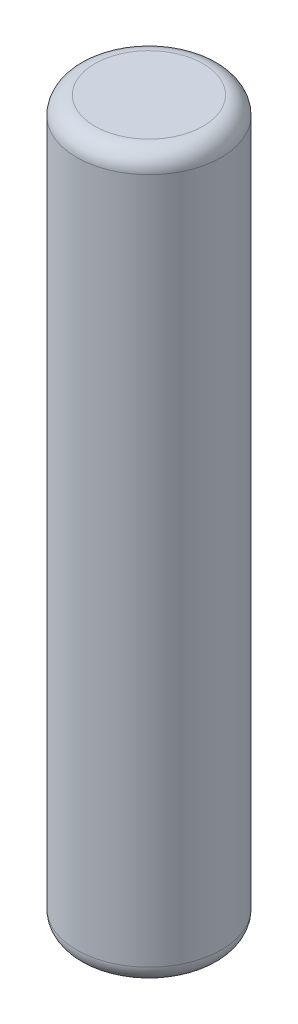
ISO-10303-21;
HEADER;
FILE_DESCRIPTION(('STEP AP214'),'2;1');
FILE_NAME('part.step','',(''),(''),'','','');
FILE_SCHEMA(('AUTOMOTIVE_DESIGN { 1 0 10303 214 1 1 1 1 }'));
ENDSEC;
DATA;
#1=APPLICATION_CONTEXT('core data for automotive mechanical design processes');
#2=APPLICATION_PROTOCOL_DEFINITION('international standard','automotive_design',2000,#1);
#3=PRODUCT_CONTEXT('',#1,'mechanical');
#4=PRODUCT('Part','Part','',(#3));
#5=PRODUCT_RELATED_PRODUCT_CATEGORY('part','',(#4));
#6=PRODUCT_DEFINITION_FORMATION('','',#4);
#7=PRODUCT_DEFINITION_CONTEXT('part definition',#1,'design');
#8=PRODUCT_DEFINITION('design','',#6,#7);
#9=PRODUCT_DEFINITION_SHAPE('','',#8);
#10=(LENGTH_UNIT() NAMED_UNIT(*) SI_UNIT(.MILLI.,.METRE.));
#11=(NAMED_UNIT(*) PLANE_ANGLE_UNIT() SI_UNIT($,.RADIAN.));
#12=(NAMED_UNIT(*) SI_UNIT($,.STERADIAN.) SOLID_ANGLE_UNIT());
#13=UNCERTAINTY_MEASURE_WITH_UNIT(LENGTH_MEASURE(1.E-05),#10,'distance_accuracy_value','');
#14=(GEOMETRIC_REPRESENTATION_CONTEXT(3) GLOBAL_UNCERTAINTY_ASSIGNED_CONTEXT((#13)) GLOBAL_UNIT_ASSIGNED_CONTEXT((#10,
#11,#12)) REPRESENTATION_CONTEXT('',''));
#15=CARTESIAN_POINT('',(0.,0.,0.));
#16=DIRECTION('',(0.,0.,1.));
#17=DIRECTION('',(1.,0.,0.));
#18=AXIS2_PLACEMENT_3D('',#15,#16,#17);
#19=CARTESIAN_POINT('',(0.,34.,0.));
#20=DIRECTION('',(0.,-1.,0.));
#21=DIRECTION('',(0.,0.,-1.));
#22=AXIS2_PLACEMENT_3D('',#19,#20,#21);
#23=CYLINDRICAL_SURFACE('',#22,2.8);
#24=CARTESIAN_POINT('',(0.,6.7,0.));
#25=DIRECTION('',(0.,1.,0.));
#26=DIRECTION('',(0.,0.,1.));
#27=AXIS2_PLACEMENT_3D('',#24,#25,#26);
#28=CIRCLE('',#27,2.8);
#29=CARTESIAN_POINT('',(0.,6.7,2.8));
#30=VERTEX_POINT('',#29);
#31=EDGE_CURVE('E44',#30,#30,#28,.T.);
#32=ORIENTED_EDGE('',*,*,#31,.T.);
#33=EDGE_LOOP('',(#32));
#34=FACE_BOUND('',#33,.T.);
#35=CARTESIAN_POINT('',(0.,33.3,0.));
#36=DIRECTION('',(0.,1.,0.));
#37=DIRECTION('',(0.,0.,1.));
#38=AXIS2_PLACEMENT_3D('',#35,#36,#37);
#39=CIRCLE('',#38,2.8);
#40=CARTESIAN_POINT('',(0.,33.3,2.8));
#41=VERTEX_POINT('',#40);
#42=EDGE_CURVE('E48',#41,#41,#39,.F.);
#43=ORIENTED_EDGE('',*,*,#42,.T.);
#44=EDGE_LOOP('',(#43));
#45=FACE_BOUND('',#44,.T.);
#46=ADVANCED_FACE('F33',(#34,#45),#23,.T.);
#47=CARTESIAN_POINT('',(0.,34.,0.));
#48=DIRECTION('',(0.,1.,0.));
#49=DIRECTION('',(0.,0.,1.));
#50=AXIS2_PLACEMENT_3D('',#47,#48,#49);
#51=PLANE('',#50);
#52=CARTESIAN_POINT('',(0.,34.,0.));
#53=DIRECTION('',(0.,1.,0.));
#54=DIRECTION('',(0.,0.,1.));
#55=AXIS2_PLACEMENT_3D('',#52,#53,#54);
#56=CIRCLE('',#55,2.1);
#57=CARTESIAN_POINT('',(0.,34.,2.1));
#58=VERTEX_POINT('',#57);
#59=EDGE_CURVE('E10',#58,#58,#56,.T.);
#60=ORIENTED_EDGE('',*,*,#59,.T.);
#61=EDGE_LOOP('',(#60));
#62=FACE_BOUND('',#61,.T.);
#63=ADVANCED_FACE('F64',(#62),#51,.T.);
#64=CARTESIAN_POINT('',(0.,6.,0.));
#65=DIRECTION('',(0.,1.,0.));
#66=DIRECTION('',(0.,0.,1.));
#67=AXIS2_PLACEMENT_3D('',#64,#65,#66);
#68=PLANE('',#67);
#69=CARTESIAN_POINT('',(0.,6.,0.));
#70=DIRECTION('',(0.,1.,0.));
#71=DIRECTION('',(0.,0.,1.));
#72=AXIS2_PLACEMENT_3D('',#69,#70,#71);
#73=CIRCLE('',#72,2.1);
#74=CARTESIAN_POINT('',(0.,6.,2.1));
#75=VERTEX_POINT('',#74);
#76=EDGE_CURVE('E40',#75,#75,#73,.F.);
#77=ORIENTED_EDGE('',*,*,#76,.T.);
#78=EDGE_LOOP('',(#77));
#79=FACE_BOUND('',#78,.T.);
#80=ADVANCED_FACE('F61',(#79),#68,.F.);
#81=CARTESIAN_POINT('',(0.,6.7,0.));
#82=DIRECTION('',(0.,1.,0.));
#83=DIRECTION('',(0.,0.,1.));
#84=AXIS2_PLACEMENT_3D('',#81,#82,#83);
#85=TOROIDAL_SURFACE('',#84,2.1,0.7);
#86=ORIENTED_EDGE('',*,*,#76,.F.);
#87=EDGE_LOOP('',(#86));
#88=FACE_BOUND('',#87,.T.);
#89=ORIENTED_EDGE('',*,*,#31,.F.);
#90=EDGE_LOOP('',(#89));
#91=FACE_BOUND('',#90,.T.);
#92=ADVANCED_FACE('F57',(#88,#91),#85,.T.);
#93=CARTESIAN_POINT('',(0.,33.3,0.));
#94=DIRECTION('',(0.,1.,0.));
#95=DIRECTION('',(0.,0.,1.));
#96=AXIS2_PLACEMENT_3D('',#93,#94,#95);
#97=TOROIDAL_SURFACE('',#96,2.1,0.7);
#98=ORIENTED_EDGE('',*,*,#42,.F.);
#99=EDGE_LOOP('',(#98));
#100=FACE_BOUND('',#99,.T.);
#101=ORIENTED_EDGE('',*,*,#59,.F.);
#102=EDGE_LOOP('',(#101));
#103=FACE_BOUND('',#102,.T.);
#104=ADVANCED_FACE('F35',(#100,#103),#97,.T.);
#105=CLOSED_SHELL('',(#46,#63,#80,#92,#104));
#106=MANIFOLD_SOLID_BREP('B2',#105);
#107=ADVANCED_BREP_SHAPE_REPRESENTATION('',(#18,#106),#14);
#108=SHAPE_DEFINITION_REPRESENTATION(#9,#107);
ENDSEC;
END-ISO-10303-21;
